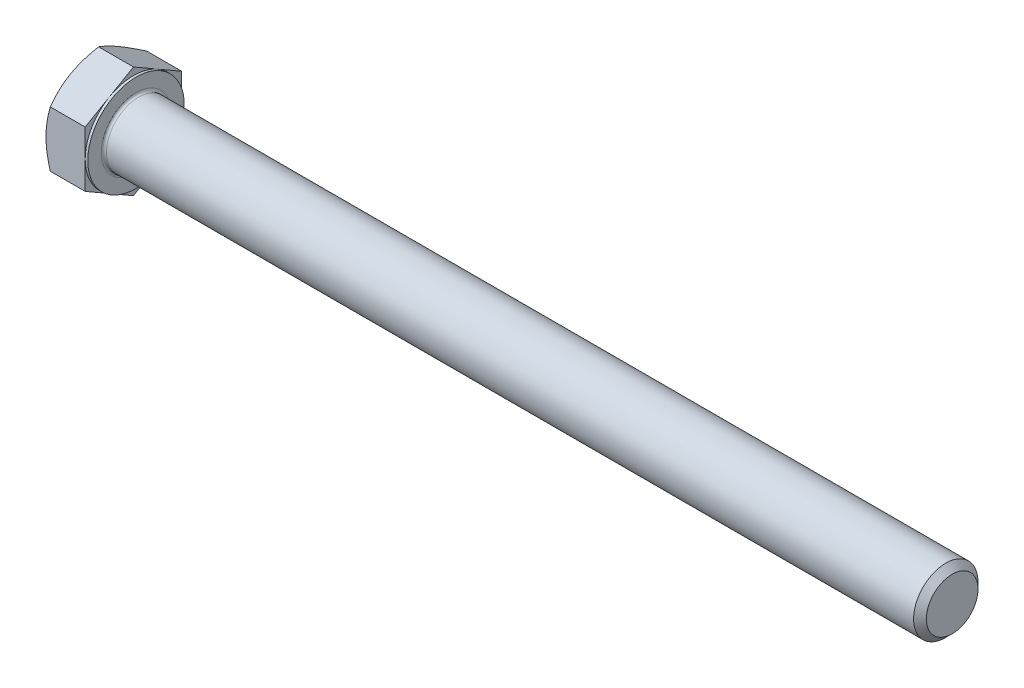
ISO-10303-21;
HEADER;
FILE_DESCRIPTION(('STEP AP214'),'2;1');
FILE_NAME('part.step','',(''),(''),'','','');
FILE_SCHEMA(('AUTOMOTIVE_DESIGN { 1 0 10303 214 1 1 1 1 }'));
ENDSEC;
DATA;
#1=APPLICATION_CONTEXT('core data for automotive mechanical design processes');
#2=APPLICATION_PROTOCOL_DEFINITION('international standard','automotive_design',2000,#1);
#3=PRODUCT_CONTEXT('',#1,'mechanical');
#4=PRODUCT('Part','Part','',(#3));
#5=PRODUCT_RELATED_PRODUCT_CATEGORY('part','',(#4));
#6=PRODUCT_DEFINITION_FORMATION('','',#4);
#7=PRODUCT_DEFINITION_CONTEXT('part definition',#1,'design');
#8=PRODUCT_DEFINITION('design','',#6,#7);
#9=PRODUCT_DEFINITION_SHAPE('','',#8);
#10=(LENGTH_UNIT() NAMED_UNIT(*) SI_UNIT(.MILLI.,.METRE.));
#11=(NAMED_UNIT(*) PLANE_ANGLE_UNIT() SI_UNIT($,.RADIAN.));
#12=(NAMED_UNIT(*) SI_UNIT($,.STERADIAN.) SOLID_ANGLE_UNIT());
#13=UNCERTAINTY_MEASURE_WITH_UNIT(LENGTH_MEASURE(1.E-05),#10,'distance_accuracy_value','');
#14=(GEOMETRIC_REPRESENTATION_CONTEXT(3) GLOBAL_UNCERTAINTY_ASSIGNED_CONTEXT((#13)) GLOBAL_UNIT_ASSIGNED_CONTEXT((#10,
#11,#12)) REPRESENTATION_CONTEXT('',''));
#15=CARTESIAN_POINT('',(0.,0.,0.));
#16=DIRECTION('',(0.,0.,1.));
#17=DIRECTION('',(1.,0.,0.));
#18=AXIS2_PLACEMENT_3D('',#15,#16,#17);
#19=CARTESIAN_POINT('',(0.,8.24155962262808,0.));
#20=DIRECTION('',(1.,0.,0.));
#21=DIRECTION('',(0.,0.,-1.));
#22=AXIS2_PLACEMENT_3D('',#19,#20,#21);
#23=PLANE('',#22);
#24=CARTESIAN_POINT('',(0.,0.,0.));
#25=DIRECTION('',(1.,0.,0.));
#26=DIRECTION('',(0.,0.,-1.));
#27=AXIS2_PLACEMENT_3D('',#24,#25,#26);
#28=CIRCLE('',#27,7.1374);
#29=CARTESIAN_POINT('',(0.,-6.18116971697105,-3.56870000000001));
#30=VERTEX_POINT('',#29);
#31=CARTESIAN_POINT('',(0.,0.,-7.1374));
#32=VERTEX_POINT('',#31);
#33=EDGE_CURVE('E114',#30,#32,#28,.T.);
#34=ORIENTED_EDGE('',*,*,#33,.F.);
#35=CARTESIAN_POINT('',(0.,0.,0.));
#36=DIRECTION('',(1.,0.,0.));
#37=DIRECTION('',(0.,0.,-1.));
#38=AXIS2_PLACEMENT_3D('',#35,#36,#37);
#39=CIRCLE('',#38,7.1374);
#40=CARTESIAN_POINT('',(0.,-6.18116971697106,3.56870000000001));
#41=VERTEX_POINT('',#40);
#42=EDGE_CURVE('E111',#41,#30,#39,.T.);
#43=ORIENTED_EDGE('',*,*,#42,.F.);
#44=CARTESIAN_POINT('',(0.,0.,0.));
#45=DIRECTION('',(1.,0.,0.));
#46=DIRECTION('',(0.,0.,-1.));
#47=AXIS2_PLACEMENT_3D('',#44,#45,#46);
#48=CIRCLE('',#47,7.1374);
#49=CARTESIAN_POINT('',(0.,0.,7.1374));
#50=VERTEX_POINT('',#49);
#51=EDGE_CURVE('E462',#50,#41,#48,.T.);
#52=ORIENTED_EDGE('',*,*,#51,.F.);
#53=CARTESIAN_POINT('',(0.,0.,0.));
#54=DIRECTION('',(1.,0.,0.));
#55=DIRECTION('',(0.,0.,-1.));
#56=AXIS2_PLACEMENT_3D('',#53,#54,#55);
#57=CIRCLE('',#56,7.1374);
#58=CARTESIAN_POINT('',(0.,6.18116971697105,3.56870000000001));
#59=VERTEX_POINT('',#58);
#60=EDGE_CURVE('E172',#59,#50,#57,.T.);
#61=ORIENTED_EDGE('',*,*,#60,.F.);
#62=CARTESIAN_POINT('',(0.,0.,0.));
#63=DIRECTION('',(1.,0.,0.));
#64=DIRECTION('',(0.,0.,-1.));
#65=AXIS2_PLACEMENT_3D('',#62,#63,#64);
#66=CIRCLE('',#65,7.1374);
#67=CARTESIAN_POINT('',(0.,6.18116971697105,-3.56870000000001));
#68=VERTEX_POINT('',#67);
#69=EDGE_CURVE('E460',#68,#59,#66,.T.);
#70=ORIENTED_EDGE('',*,*,#69,.F.);
#71=CARTESIAN_POINT('',(0.,0.,0.));
#72=DIRECTION('',(1.,0.,0.));
#73=DIRECTION('',(0.,0.,-1.));
#74=AXIS2_PLACEMENT_3D('',#71,#72,#73);
#75=CIRCLE('',#74,7.1374);
#76=EDGE_CURVE('E117',#32,#68,#75,.T.);
#77=ORIENTED_EDGE('',*,*,#76,.F.);
#78=EDGE_LOOP('',(#34,#43,#52,#61,#70,#77));
#79=FACE_BOUND('',#78,.T.);
#80=ADVANCED_FACE('F17',(#79),#23,.F.);
#81=CARTESIAN_POINT('',(0.641311776484754,0.,0.));
#82=DIRECTION('',(1.,0.,0.));
#83=DIRECTION('',(0.,0.,-1.));
#84=AXIS2_PLACEMENT_3D('',#81,#82,#83);
#85=CONICAL_SURFACE('',#84,8.24818458036387,1.0471975511966);
#86=ORIENTED_EDGE('',*,*,#42,.T.);
#87=CARTESIAN_POINT('',(0.,-6.18116971697106,-3.56870000000002));
#88=CARTESIAN_POINT('',(-2.91702878281906E-05,-6.26862170985652,-3.41722870509925));
#89=CARTESIAN_POINT('',(0.00371114889844038,-6.35606948988297,-3.26576470708432));
#90=CARTESIAN_POINT('',(0.0185139577467835,-6.53079334497843,-2.9631341127647));
#91=CARTESIAN_POINT('',(0.0295749978503088,-6.61806945060963,-2.81196746352471));
#92=CARTESIAN_POINT('',(0.0587296036169501,-6.7918862225359,-2.5109079833408));
#93=CARTESIAN_POINT('',(0.0767877659737066,-6.87842838481195,-2.3610125612818));
#94=CARTESIAN_POINT('',(0.119548178265526,-7.05110039256495,-2.06193587080869));
#95=CARTESIAN_POINT('',(0.144250603082628,-7.13723022712836,-1.91275462129736));
#96=CARTESIAN_POINT('',(0.227561148311189,-7.39464422393007,-1.46690050025742));
#97=CARTESIAN_POINT('',(0.295412992760169,-7.56518058886256,-1.17152285165624));
#98=CARTESIAN_POINT('',(0.451896700790797,-7.90478678087675,-0.583307672522674));
#99=CARTESIAN_POINT('',(0.540632343376944,-8.07384476218822,-0.290490659466179));
#100=CARTESIAN_POINT('',(0.637486855352638,-8.2415596226281,0.));
#101=B_SPLINE_CURVE_WITH_KNOTS('',3,(#87,#88,#89,#90,#91,#92,#93,#94,#95,#96,#97,#98,#99,#100),
.UNSPECIFIED.,.F.,.F.,(4,2,2,2,2,2,4),(0.,0.524658409500519,1.04921296370403,1.5711473776056,
2.09309553056225,3.13562382142666,4.18344647054619),.UNSPECIFIED.);
#102=CARTESIAN_POINT('',(0.637486855352637,-8.2415596226281,0.));
#103=VERTEX_POINT('',#102);
#104=EDGE_CURVE('E129',#30,#103,#101,.T.);
#105=ORIENTED_EDGE('',*,*,#104,.T.);
#106=CARTESIAN_POINT('',(0.637486855352637,-8.2415596226281,0.));
#107=CARTESIAN_POINT('',(0.540632343376944,-8.07384476218822,0.290490659466181));
#108=CARTESIAN_POINT('',(0.451896700790797,-7.90478678087675,0.583307672522676));
#109=CARTESIAN_POINT('',(0.295412992760169,-7.56518058886257,1.17152285165624));
#110=CARTESIAN_POINT('',(0.227561148311189,-7.39464422393008,1.46690050025742));
#111=CARTESIAN_POINT('',(0.14425060308263,-7.13723022712836,1.91275462129736));
#112=CARTESIAN_POINT('',(0.119548178265528,-7.05110039256495,2.06193587080869));
#113=CARTESIAN_POINT('',(0.0767877659737086,-6.87842838481196,2.3610125612818));
#114=CARTESIAN_POINT('',(0.0587296036169518,-6.7918862225359,2.5109079833408));
#115=CARTESIAN_POINT('',(0.0295749978503104,-6.61806945060963,2.81196746352471));
#116=CARTESIAN_POINT('',(0.0185139577467855,-6.53079334497843,2.9631341127647));
#117=CARTESIAN_POINT('',(0.00371114889844278,-6.35606948988298,3.26576470708432));
#118=CARTESIAN_POINT('',(-2.91702878256121E-05,-6.26862170985652,3.41722870509925));
#119=CARTESIAN_POINT('',(0.,-6.18116971697107,3.56870000000002));
#120=B_SPLINE_CURVE_WITH_KNOTS('',3,(#106,#107,#108,#109,#110,#111,#112,#113,#114,#115,#116,
#117,#118,#119),.UNSPECIFIED.,.F.,.F.,(4,2,2,2,2,2,4),(0.,1.04782264911953,2.09035093998394,
2.61229909294058,3.13423350684215,3.65878806104566,4.18344647054618),.UNSPECIFIED.);
#121=EDGE_CURVE('E135',#103,#41,#120,.T.);
#122=ORIENTED_EDGE('',*,*,#121,.T.);
#123=EDGE_LOOP('',(#86,#105,#122));
#124=FACE_BOUND('',#123,.T.);
#125=ADVANCED_FACE('F133',(#124),#85,.T.);
#126=CARTESIAN_POINT('',(0.641311776484743,0.,0.));
#127=DIRECTION('',(1.,0.,0.));
#128=DIRECTION('',(0.,0.,-1.));
#129=AXIS2_PLACEMENT_3D('',#126,#127,#128);
#130=CONICAL_SURFACE('',#129,8.24818458036385,1.0471975511966);
#131=ORIENTED_EDGE('',*,*,#33,.T.);
#132=CARTESIAN_POINT('',(0.,0.,-7.1374));
#133=CARTESIAN_POINT('',(-2.91702878363875E-05,-0.174903985770917,-7.1374));
#134=CARTESIAN_POINT('',(0.0037111488984321,-0.349799545823828,-7.1374));
#135=CARTESIAN_POINT('',(0.0185139577467752,-0.699247256014727,-7.1374));
#136=CARTESIAN_POINT('',(0.0295749978503004,-0.873799467277128,-7.1374));
#137=CARTESIAN_POINT('',(0.0587296036169417,-1.22143301112966,-7.1374));
#138=CARTESIAN_POINT('',(0.0767877659736981,-1.39451733568178,-7.1374));
#139=CARTESIAN_POINT('',(0.119548178265518,-1.73986135118776,-7.1374));
#140=CARTESIAN_POINT('',(0.144250603082619,-1.91212102031459,-7.1374));
#141=CARTESIAN_POINT('',(0.227561148311179,-2.42694901391801,-7.1374));
#142=CARTESIAN_POINT('',(0.295412992760159,-2.76802174378299,-7.1374));
#143=CARTESIAN_POINT('',(0.451896700790786,-3.44723412781136,-7.1374));
#144=CARTESIAN_POINT('',(0.540632343376933,-3.7853500904343,-7.1374));
#145=CARTESIAN_POINT('',(0.637486855352627,-4.12077981131404,-7.1374));
#146=B_SPLINE_CURVE_WITH_KNOTS('',3,(#132,#133,#134,#135,#136,#137,#138,#139,#140,#141,#142,
#143,#144,#145),.UNSPECIFIED.,.F.,.F.,(4,2,2,2,2,2,4),(0.,0.524658409500517,1.04921296370403,
1.5711473776056,2.09309553056224,3.13562382142665,4.18344647054617),.UNSPECIFIED.);
#147=CARTESIAN_POINT('',(0.637486855352626,-4.12077981131404,-7.1374));
#148=VERTEX_POINT('',#147);
#149=EDGE_CURVE('E125',#32,#148,#146,.T.);
#150=ORIENTED_EDGE('',*,*,#149,.T.);
#151=CARTESIAN_POINT('',(0.637486855352626,-4.12077981131404,-7.1374));
#152=CARTESIAN_POINT('',(0.540632343376933,-4.28849467175391,-6.84690934053382));
#153=CARTESIAN_POINT('',(0.451896700790788,-4.45755265306538,-6.55409232747733));
#154=CARTESIAN_POINT('',(0.295412992760162,-4.79715884507957,-5.96587714834377));
#155=CARTESIAN_POINT('',(0.227561148311183,-4.96769521001206,-5.6704994997426));
#156=CARTESIAN_POINT('',(0.144250603082625,-5.22510920681377,-5.22464537870266));
#157=CARTESIAN_POINT('',(0.119548178265524,-5.31123904137718,-5.07546412919133));
#158=CARTESIAN_POINT('',(0.076787765973705,-5.48391104913017,-4.77638743871822));
#159=CARTESIAN_POINT('',(0.0587296036169484,-5.57045321140623,-4.62649201665922));
#160=CARTESIAN_POINT('',(0.0295749978503076,-5.7442699833325,-4.32543253647532));
#161=CARTESIAN_POINT('',(0.0185139577467831,-5.8315460889637,-4.17426588723533));
#162=CARTESIAN_POINT('',(0.00371114889844091,-6.00626994405915,-3.87163529291571));
#163=CARTESIAN_POINT('',(-2.91702878274496E-05,-6.0937177240856,-3.72017129490078));
#164=CARTESIAN_POINT('',(0.,-6.18116971697106,-3.56870000000002));
#165=B_SPLINE_CURVE_WITH_KNOTS('',3,(#151,#152,#153,#154,#155,#156,#157,#158,#159,#160,#161,
#162,#163,#164),.UNSPECIFIED.,.F.,.F.,(4,2,2,2,2,2,4),(0.,1.04782264911952,2.09035093998392,
2.61229909294056,3.13423350684212,3.65878806104563,4.18344647054614),.UNSPECIFIED.);
#166=EDGE_CURVE('E123',#148,#30,#165,.T.);
#167=ORIENTED_EDGE('',*,*,#166,.T.);
#168=EDGE_LOOP('',(#131,#150,#167));
#169=FACE_BOUND('',#168,.T.);
#170=ADVANCED_FACE('F124',(#169),#130,.T.);
#171=CARTESIAN_POINT('',(0.641311776484739,0.,0.));
#172=DIRECTION('',(1.,0.,0.));
#173=DIRECTION('',(0.,0.,-1.));
#174=AXIS2_PLACEMENT_3D('',#171,#172,#173);
#175=CONICAL_SURFACE('',#174,8.24818458036384,1.0471975511966);
#176=CARTESIAN_POINT('',(0.637486855352624,4.12077981131404,-7.1374));
#177=CARTESIAN_POINT('',(0.540632343376931,3.78535009043429,-7.1374));
#178=CARTESIAN_POINT('',(0.451896700790785,3.44723412781136,-7.1374));
#179=CARTESIAN_POINT('',(0.295412992760157,2.76802174378299,-7.1374));
#180=CARTESIAN_POINT('',(0.227561148311177,2.42694901391801,-7.1374));
#181=CARTESIAN_POINT('',(0.144250603082619,1.91212102031458,-7.1374));
#182=CARTESIAN_POINT('',(0.119548178265517,1.73986135118776,-7.1374));
#183=CARTESIAN_POINT('',(0.076787765973698,1.39451733568178,-7.1374));
#184=CARTESIAN_POINT('',(0.0587296036169412,1.22143301112966,-7.1374));
#185=CARTESIAN_POINT('',(0.0295749978502998,0.873799467277126,-7.1374));
#186=CARTESIAN_POINT('',(0.018513957746775,0.699247256014726,-7.1374));
#187=CARTESIAN_POINT('',(0.0037111488984325,0.349799545823827,-7.1374));
#188=CARTESIAN_POINT('',(-2.91702878357943E-05,0.174903985770916,-7.1374));
#189=CARTESIAN_POINT('',(0.,0.,-7.1374));
#190=B_SPLINE_CURVE_WITH_KNOTS('',3,(#176,#177,#178,#179,#180,#181,#182,#183,#184,#185,#186,
#187,#188,#189),.UNSPECIFIED.,.F.,.F.,(4,2,2,2,2,2,4),(0.,1.04782264911952,2.09035093998393,
2.61229909294057,3.13423350684214,3.65878806104565,4.18344647054616),.UNSPECIFIED.);
#191=CARTESIAN_POINT('',(0.637486855352624,4.12077981131404,-7.1374));
#192=VERTEX_POINT('',#191);
#193=EDGE_CURVE('E143',#192,#32,#190,.T.);
#194=ORIENTED_EDGE('',*,*,#193,.T.);
#195=ORIENTED_EDGE('',*,*,#76,.T.);
#196=CARTESIAN_POINT('',(0.,6.18116971697105,-3.56870000000001));
#197=CARTESIAN_POINT('',(-2.9170287832926E-05,6.0937177240856,-3.72017129490077));
#198=CARTESIAN_POINT('',(0.00371114889843545,6.00626994405914,-3.8716352929157));
#199=CARTESIAN_POINT('',(0.018513957746778,5.83154608896369,-4.17426588723532));
#200=CARTESIAN_POINT('',(0.0295749978503029,5.74426998333249,-4.32543253647531));
#201=CARTESIAN_POINT('',(0.0587296036169437,5.57045321140622,-4.62649201665922));
#202=CARTESIAN_POINT('',(0.0767877659737001,5.48391104913017,-4.77638743871822));
#203=CARTESIAN_POINT('',(0.119548178265519,5.31123904137718,-5.07546412919132));
#204=CARTESIAN_POINT('',(0.144250603082621,5.22510920681376,-5.22464537870265));
#205=CARTESIAN_POINT('',(0.22756114831118,4.96769521001205,-5.67049949974259));
#206=CARTESIAN_POINT('',(0.295412992760159,4.79715884507956,-5.96587714834377));
#207=CARTESIAN_POINT('',(0.451896700790785,4.45755265306538,-6.55409232747733));
#208=CARTESIAN_POINT('',(0.540632343376931,4.28849467175391,-6.84690934053382));
#209=CARTESIAN_POINT('',(0.637486855352624,4.12077981131404,-7.1374));
#210=B_SPLINE_CURVE_WITH_KNOTS('',3,(#196,#197,#198,#199,#200,#201,#202,#203,#204,#205,#206,
#207,#208,#209),.UNSPECIFIED.,.F.,.F.,(4,2,2,2,2,2,4),(0.,0.524658409500515,1.04921296370402,
1.57114737760559,2.09309553056223,3.13562382142663,4.18344647054615),.UNSPECIFIED.);
#211=EDGE_CURVE('E249',#68,#192,#210,.T.);
#212=ORIENTED_EDGE('',*,*,#211,.T.);
#213=EDGE_LOOP('',(#194,#195,#212));
#214=FACE_BOUND('',#213,.T.);
#215=ADVANCED_FACE('F239',(#214),#175,.T.);
#216=CARTESIAN_POINT('',(0.641311776484745,0.,0.));
#217=DIRECTION('',(1.,0.,0.));
#218=DIRECTION('',(0.,0.,-1.));
#219=AXIS2_PLACEMENT_3D('',#216,#217,#218);
#220=CONICAL_SURFACE('',#219,8.24818458036385,1.0471975511966);
#221=CARTESIAN_POINT('',(0.637486855352629,8.24155962262808,0.));
#222=CARTESIAN_POINT('',(0.540632343376936,8.07384476218821,-0.290490659466181));
#223=CARTESIAN_POINT('',(0.45189670079079,7.90478678087674,-0.583307672522675));
#224=CARTESIAN_POINT('',(0.295412992760162,7.56518058886255,-1.17152285165624));
#225=CARTESIAN_POINT('',(0.227561148311182,7.39464422393006,-1.46690050025742));
#226=CARTESIAN_POINT('',(0.144250603082622,7.13723022712835,-1.91275462129736));
#227=CARTESIAN_POINT('',(0.119548178265521,7.05110039256494,-2.06193587080869));
#228=CARTESIAN_POINT('',(0.076787765973701,6.87842838481194,-2.3610125612818));
#229=CARTESIAN_POINT('',(0.0587296036169442,6.79188622253589,-2.5109079833408));
#230=CARTESIAN_POINT('',(0.0295749978503029,6.61806945060962,-2.81196746352471));
#231=CARTESIAN_POINT('',(0.018513957746778,6.53079334497842,-2.96313411276469));
#232=CARTESIAN_POINT('',(0.00371114889843529,6.35606948988297,-3.26576470708432));
#233=CARTESIAN_POINT('',(-2.91702878331806E-05,6.26862170985651,-3.41722870509924));
#234=CARTESIAN_POINT('',(0.,6.18116971697105,-3.56870000000001));
#235=B_SPLINE_CURVE_WITH_KNOTS('',3,(#221,#222,#223,#224,#225,#226,#227,#228,#229,#230,#231,
#232,#233,#234),.UNSPECIFIED.,.F.,.F.,(4,2,2,2,2,2,4),(0.,1.04782264911952,2.09035093998393,
2.61229909294058,3.13423350684215,3.65878806104566,4.18344647054617),.UNSPECIFIED.);
#236=CARTESIAN_POINT('',(0.637486855352629,8.24155962262808,0.));
#237=VERTEX_POINT('',#236);
#238=EDGE_CURVE('E244',#237,#68,#235,.T.);
#239=ORIENTED_EDGE('',*,*,#238,.T.);
#240=ORIENTED_EDGE('',*,*,#69,.T.);
#241=CARTESIAN_POINT('',(0.,6.18116971697105,3.56870000000001));
#242=CARTESIAN_POINT('',(-2.9170287834756E-05,6.26862170985651,3.41722870509925));
#243=CARTESIAN_POINT('',(0.00371114889843365,6.35606948988296,3.26576470708432));
#244=CARTESIAN_POINT('',(0.018513957746776,6.53079334497841,2.9631341127647));
#245=CARTESIAN_POINT('',(0.0295749978503007,6.61806945060961,2.81196746352471));
#246=CARTESIAN_POINT('',(0.0587296036169419,6.79188622253588,2.5109079833408));
#247=CARTESIAN_POINT('',(0.0767877659736988,6.87842838481194,2.3610125612818));
#248=CARTESIAN_POINT('',(0.119548178265519,7.05110039256493,2.06193587080869));
#249=CARTESIAN_POINT('',(0.14425060308262,7.13723022712835,1.91275462129736));
#250=CARTESIAN_POINT('',(0.22756114831118,7.39464422393006,1.46690050025742));
#251=CARTESIAN_POINT('',(0.295412992760161,7.56518058886255,1.17152285165624));
#252=CARTESIAN_POINT('',(0.451896700790789,7.90478678087674,0.583307672522675));
#253=CARTESIAN_POINT('',(0.540632343376935,8.07384476218821,0.29049065946618));
#254=CARTESIAN_POINT('',(0.637486855352629,8.24155962262808,0.));
#255=B_SPLINE_CURVE_WITH_KNOTS('',3,(#241,#242,#243,#244,#245,#246,#247,#248,#249,#250,#251,
#252,#253,#254),.UNSPECIFIED.,.F.,.F.,(4,2,2,2,2,2,4),(0.,0.524658409500518,1.04921296370403,
1.5711473776056,2.09309553056224,3.13562382142665,4.18344647054618),.UNSPECIFIED.);
#256=EDGE_CURVE('E231',#59,#237,#255,.T.);
#257=ORIENTED_EDGE('',*,*,#256,.T.);
#258=EDGE_LOOP('',(#239,#240,#257));
#259=FACE_BOUND('',#258,.T.);
#260=ADVANCED_FACE('F236',(#259),#220,.T.);
#261=CARTESIAN_POINT('',(0.641311776484745,0.,0.));
#262=DIRECTION('',(1.,0.,0.));
#263=DIRECTION('',(0.,0.,-1.));
#264=AXIS2_PLACEMENT_3D('',#261,#262,#263);
#265=CONICAL_SURFACE('',#264,8.24818458036385,1.0471975511966);
#266=ORIENTED_EDGE('',*,*,#51,.T.);
#267=CARTESIAN_POINT('',(0.,-6.18116971697107,3.56870000000002));
#268=CARTESIAN_POINT('',(-2.9170287825595E-05,-6.09371772408561,3.72017129490078));
#269=CARTESIAN_POINT('',(0.00371114889844298,-6.00626994405915,3.87163529291571));
#270=CARTESIAN_POINT('',(0.0185139577467859,-5.8315460889637,4.17426588723533));
#271=CARTESIAN_POINT('',(0.0295749978503109,-5.7442699833325,4.32543253647531));
#272=CARTESIAN_POINT('',(0.0587296036169516,-5.57045321140624,4.62649201665922));
#273=CARTESIAN_POINT('',(0.0767877659737078,-5.48391104913018,4.77638743871822));
#274=CARTESIAN_POINT('',(0.119548178265527,-5.31123904137719,5.07546412919133));
#275=CARTESIAN_POINT('',(0.144250603082628,-5.22510920681378,5.22464537870266));
#276=CARTESIAN_POINT('',(0.227561148311187,-4.96769521001206,5.6704994997426));
#277=CARTESIAN_POINT('',(0.295412992760166,-4.79715884507958,5.96587714834377));
#278=CARTESIAN_POINT('',(0.451896700790791,-4.45755265306539,6.55409232747733));
#279=CARTESIAN_POINT('',(0.540632343376936,-4.28849467175392,6.84690934053382));
#280=CARTESIAN_POINT('',(0.637486855352629,-4.12077981131405,7.1374));
#281=B_SPLINE_CURVE_WITH_KNOTS('',3,(#267,#268,#269,#270,#271,#272,#273,#274,#275,#276,#277,
#278,#279,#280),.UNSPECIFIED.,.F.,.F.,(4,2,2,2,2,2,4),(0.,0.524658409500513,1.04921296370402,
1.57114737760559,2.09309553056223,3.13562382142663,4.18344647054615),.UNSPECIFIED.);
#282=CARTESIAN_POINT('',(0.637486855352629,-4.12077981131405,7.1374));
#283=VERTEX_POINT('',#282);
#284=EDGE_CURVE('E130',#41,#283,#281,.T.);
#285=ORIENTED_EDGE('',*,*,#284,.T.);
#286=CARTESIAN_POINT('',(0.637486855352629,-4.12077981131405,7.1374));
#287=CARTESIAN_POINT('',(0.540632343376935,-3.78535009043431,7.1374));
#288=CARTESIAN_POINT('',(0.451896700790788,-3.44723412781137,7.1374));
#289=CARTESIAN_POINT('',(0.29541299276016,-2.768021743783,7.1374));
#290=CARTESIAN_POINT('',(0.22756114831118,-2.42694901391802,7.1374));
#291=CARTESIAN_POINT('',(0.14425060308262,-1.91212102031459,7.1374));
#292=CARTESIAN_POINT('',(0.119548178265519,-1.73986135118776,7.1374));
#293=CARTESIAN_POINT('',(0.0767877659736989,-1.39451733568178,7.1374));
#294=CARTESIAN_POINT('',(0.0587296036169421,-1.22143301112967,7.1374));
#295=CARTESIAN_POINT('',(0.0295749978503008,-0.87379946727713,7.1374));
#296=CARTESIAN_POINT('',(0.018513957746776,-0.699247256014728,7.1374));
#297=CARTESIAN_POINT('',(0.00371114889843334,-0.349799545823828,7.1374));
#298=CARTESIAN_POINT('',(-2.91702878350887E-05,-0.174903985770916,7.1374));
#299=CARTESIAN_POINT('',(0.,0.,7.1374));
#300=B_SPLINE_CURVE_WITH_KNOTS('',3,(#286,#287,#288,#289,#290,#291,#292,#293,#294,#295,#296,
#297,#298,#299),.UNSPECIFIED.,.F.,.F.,(4,2,2,2,2,2,4),(0.,1.04782264911953,2.09035093998394,
2.61229909294058,3.13423350684215,3.65878806104566,4.18344647054618),.UNSPECIFIED.);
#301=EDGE_CURVE('E209',#283,#50,#300,.T.);
#302=ORIENTED_EDGE('',*,*,#301,.T.);
#303=EDGE_LOOP('',(#266,#285,#302));
#304=FACE_BOUND('',#303,.T.);
#305=ADVANCED_FACE('F187',(#304),#265,.T.);
#306=CARTESIAN_POINT('',(0.641311776484738,0.,0.));
#307=DIRECTION('',(1.,0.,0.));
#308=DIRECTION('',(0.,0.,-1.));
#309=AXIS2_PLACEMENT_3D('',#306,#307,#308);
#310=CONICAL_SURFACE('',#309,8.24818458036384,1.0471975511966);
#311=CARTESIAN_POINT('',(0.637486855352622,4.12077981131403,7.1374));
#312=CARTESIAN_POINT('',(0.540632343376929,4.2884946717539,6.84690934053382));
#313=CARTESIAN_POINT('',(0.451896700790783,4.45755265306537,6.55409232747733));
#314=CARTESIAN_POINT('',(0.295412992760157,4.79715884507955,5.96587714834377));
#315=CARTESIAN_POINT('',(0.227561148311178,4.96769521001204,5.67049949974259));
#316=CARTESIAN_POINT('',(0.144250603082619,5.22510920681376,5.22464537870266));
#317=CARTESIAN_POINT('',(0.119548178265518,5.31123904137717,5.07546412919132));
#318=CARTESIAN_POINT('',(0.0767877659736985,5.48391104913016,4.77638743871822));
#319=CARTESIAN_POINT('',(0.0587296036169418,5.57045321140622,4.62649201665922));
#320=CARTESIAN_POINT('',(0.0295749978503007,5.74426998333248,4.32543253647531));
#321=CARTESIAN_POINT('',(0.0185139577467759,5.83154608896368,4.17426588723532));
#322=CARTESIAN_POINT('',(0.00371114889843337,6.00626994405913,3.8716352929157));
#323=CARTESIAN_POINT('',(-2.91702878350612E-05,6.09371772408559,3.72017129490078));
#324=CARTESIAN_POINT('',(0.,6.18116971697105,3.56870000000001));
#325=B_SPLINE_CURVE_WITH_KNOTS('',3,(#311,#312,#313,#314,#315,#316,#317,#318,#319,#320,#321,
#322,#323,#324),.UNSPECIFIED.,.F.,.F.,(4,2,2,2,2,2,4),(0.,1.04782264911952,2.09035093998392,
2.61229909294056,3.13423350684213,3.65878806104564,4.18344647054615),.UNSPECIFIED.);
#326=CARTESIAN_POINT('',(0.637486855352622,4.12077981131403,7.1374));
#327=VERTEX_POINT('',#326);
#328=EDGE_CURVE('E193',#327,#59,#325,.T.);
#329=ORIENTED_EDGE('',*,*,#328,.T.);
#330=ORIENTED_EDGE('',*,*,#60,.T.);
#331=CARTESIAN_POINT('',(0.,0.,7.1374));
#332=CARTESIAN_POINT('',(-2.91702878350349E-05,0.174903985770917,7.1374));
#333=CARTESIAN_POINT('',(0.00371114889843339,0.349799545823827,7.1374));
#334=CARTESIAN_POINT('',(0.0185139577467758,0.699247256014725,7.1374));
#335=CARTESIAN_POINT('',(0.0295749978503005,0.873799467277125,7.1374));
#336=CARTESIAN_POINT('',(0.0587296036169414,1.22143301112966,7.1374));
#337=CARTESIAN_POINT('',(0.076787765973698,1.39451733568177,7.1374));
#338=CARTESIAN_POINT('',(0.119548178265517,1.73986135118775,7.1374));
#339=CARTESIAN_POINT('',(0.144250603082619,1.91212102031458,7.1374));
#340=CARTESIAN_POINT('',(0.227561148311177,2.426949013918,7.1374));
#341=CARTESIAN_POINT('',(0.295412992760157,2.76802174378298,7.1374));
#342=CARTESIAN_POINT('',(0.451896700790783,3.44723412781135,7.1374));
#343=CARTESIAN_POINT('',(0.540632343376929,3.78535009043429,7.1374));
#344=CARTESIAN_POINT('',(0.637486855352622,4.12077981131403,7.1374));
#345=B_SPLINE_CURVE_WITH_KNOTS('',3,(#331,#332,#333,#334,#335,#336,#337,#338,#339,#340,#341,
#342,#343,#344),.UNSPECIFIED.,.F.,.F.,(4,2,2,2,2,2,4),(0.,0.524658409500515,1.04921296370402,
1.57114737760559,2.09309553056223,3.13562382142663,4.18344647054615),.UNSPECIFIED.);
#346=EDGE_CURVE('E201',#50,#327,#345,.T.);
#347=ORIENTED_EDGE('',*,*,#346,.T.);
#348=EDGE_LOOP('',(#329,#330,#347));
#349=FACE_BOUND('',#348,.T.);
#350=ADVANCED_FACE('F182',(#349),#310,.T.);
#351=CARTESIAN_POINT('',(6.1722,-8.2415596226281,0.));
#352=DIRECTION('',(0.,0.866025403784438,-0.500000000000001));
#353=DIRECTION('',(0.,0.500000000000001,0.866025403784438));
#354=AXIS2_PLACEMENT_3D('',#351,#352,#353);
#355=PLANE('',#354);
#356=DIRECTION('',(-1.,0.,0.));
#357=VECTOR('',#356,1.);
#358=CARTESIAN_POINT('',(6.1722,-4.12077981131405,7.1374));
#359=LINE('',#358,#357);
#360=CARTESIAN_POINT('',(5.7912,-4.12077981131405,7.1374));
#361=VERTEX_POINT('',#360);
#362=EDGE_CURVE('E386',#361,#283,#359,.T.);
#363=ORIENTED_EDGE('',*,*,#362,.T.);
#364=ORIENTED_EDGE('',*,*,#284,.F.);
#365=ORIENTED_EDGE('',*,*,#121,.F.);
#366=DIRECTION('',(1.,0.,0.));
#367=VECTOR('',#366,1.);
#368=CARTESIAN_POINT('',(6.1722,-8.2415596226281,0.));
#369=LINE('',#368,#367);
#370=CARTESIAN_POINT('',(5.7912,-8.2415596226281,0.));
#371=VERTEX_POINT('',#370);
#372=EDGE_CURVE('E141',#103,#371,#369,.T.);
#373=ORIENTED_EDGE('',*,*,#372,.T.);
#374=DIRECTION('',(0.,-0.500000000000005,-0.866025403784436));
#375=VECTOR('',#374,1.);
#376=CARTESIAN_POINT('',(5.7912,-6.18116971697105,3.5687));
#377=LINE('',#376,#375);
#378=CARTESIAN_POINT('',(5.7912,-6.18116971697105,3.5687));
#379=VERTEX_POINT('',#378);
#380=EDGE_CURVE('E366',#379,#371,#377,.T.);
#381=ORIENTED_EDGE('',*,*,#380,.F.);
#382=DIRECTION('',(0.,-0.499999999999996,-0.866025403784441));
#383=VECTOR('',#382,1.);
#384=CARTESIAN_POINT('',(5.7912,-4.12077981131405,7.1374));
#385=LINE('',#384,#383);
#386=EDGE_CURVE('E371',#361,#379,#385,.T.);
#387=ORIENTED_EDGE('',*,*,#386,.F.);
#388=EDGE_LOOP('',(#363,#364,#365,#373,#381,#387));
#389=FACE_BOUND('',#388,.T.);
#390=ADVANCED_FACE('F178',(#389),#355,.F.);
#391=CARTESIAN_POINT('',(6.1722,-4.12077981131404,-7.1374));
#392=DIRECTION('',(0.,0.866025403784438,0.500000000000001));
#393=DIRECTION('',(0.,-0.500000000000001,0.866025403784438));
#394=AXIS2_PLACEMENT_3D('',#391,#392,#393);
#395=PLANE('',#394);
#396=ORIENTED_EDGE('',*,*,#372,.F.);
#397=ORIENTED_EDGE('',*,*,#104,.F.);
#398=ORIENTED_EDGE('',*,*,#166,.F.);
#399=DIRECTION('',(1.,0.,0.));
#400=VECTOR('',#399,1.);
#401=CARTESIAN_POINT('',(6.1722,-4.12077981131404,-7.1374));
#402=LINE('',#401,#400);
#403=CARTESIAN_POINT('',(5.7912,-4.12077981131404,-7.1374));
#404=VERTEX_POINT('',#403);
#405=EDGE_CURVE('E250',#148,#404,#402,.T.);
#406=ORIENTED_EDGE('',*,*,#405,.T.);
#407=DIRECTION('',(0.,0.499999999999998,-0.866025403784439));
#408=VECTOR('',#407,1.);
#409=CARTESIAN_POINT('',(5.7912,-6.18116971697105,-3.56870000000001));
#410=LINE('',#409,#408);
#411=CARTESIAN_POINT('',(5.7912,-6.18116971697104,-3.56870000000001));
#412=VERTEX_POINT('',#411);
#413=EDGE_CURVE('E356',#412,#404,#410,.T.);
#414=ORIENTED_EDGE('',*,*,#413,.F.);
#415=DIRECTION('',(0.,0.500000000000005,-0.866025403784436));
#416=VECTOR('',#415,1.);
#417=CARTESIAN_POINT('',(5.7912,-8.2415596226281,0.));
#418=LINE('',#417,#416);
#419=EDGE_CURVE('E361',#371,#412,#418,.T.);
#420=ORIENTED_EDGE('',*,*,#419,.F.);
#421=EDGE_LOOP('',(#396,#397,#398,#406,#414,#420));
#422=FACE_BOUND('',#421,.T.);
#423=ADVANCED_FACE('F139',(#422),#395,.F.);
#424=CARTESIAN_POINT('',(6.1722,4.12077981131404,-7.1374));
#425=DIRECTION('',(0.,0.,1.));
#426=DIRECTION('',(0.,-1.,0.));
#427=AXIS2_PLACEMENT_3D('',#424,#425,#426);
#428=PLANE('',#427);
#429=ORIENTED_EDGE('',*,*,#405,.F.);
#430=ORIENTED_EDGE('',*,*,#149,.F.);
#431=ORIENTED_EDGE('',*,*,#193,.F.);
#432=DIRECTION('',(1.,0.,0.));
#433=VECTOR('',#432,1.);
#434=CARTESIAN_POINT('',(6.1722,4.12077981131404,-7.1374));
#435=LINE('',#434,#433);
#436=CARTESIAN_POINT('',(5.7912,4.12077981131404,-7.1374));
#437=VERTEX_POINT('',#436);
#438=EDGE_CURVE('E394',#192,#437,#435,.T.);
#439=ORIENTED_EDGE('',*,*,#438,.T.);
#440=DIRECTION('',(0.,1.,0.));
#441=VECTOR('',#440,1.);
#442=CARTESIAN_POINT('',(5.7912,7.1374,-7.1374));
#443=LINE('',#442,#441);
#444=CARTESIAN_POINT('',(5.7912,0.,-7.1374));
#445=VERTEX_POINT('',#444);
#446=EDGE_CURVE('E341',#445,#437,#443,.T.);
#447=ORIENTED_EDGE('',*,*,#446,.F.);
#448=DIRECTION('',(0.,1.,0.));
#449=VECTOR('',#448,1.);
#450=CARTESIAN_POINT('',(5.7912,7.1374,-7.1374));
#451=LINE('',#450,#449);
#452=EDGE_CURVE('E351',#404,#445,#451,.T.);
#453=ORIENTED_EDGE('',*,*,#452,.F.);
#454=EDGE_LOOP('',(#429,#430,#431,#439,#447,#453));
#455=FACE_BOUND('',#454,.T.);
#456=ADVANCED_FACE('F257',(#455),#428,.F.);
#457=CARTESIAN_POINT('',(6.1722,4.12077981131404,-7.1374));
#458=DIRECTION('',(0.,-0.866025403784438,0.500000000000001));
#459=DIRECTION('',(0.,-0.500000000000001,-0.866025403784438));
#460=AXIS2_PLACEMENT_3D('',#457,#458,#459);
#461=PLANE('',#460);
#462=ORIENTED_EDGE('',*,*,#438,.F.);
#463=ORIENTED_EDGE('',*,*,#211,.F.);
#464=ORIENTED_EDGE('',*,*,#238,.F.);
#465=DIRECTION('',(1.,0.,0.));
#466=VECTOR('',#465,1.);
#467=CARTESIAN_POINT('',(6.1722,8.24155962262808,0.));
#468=LINE('',#467,#466);
#469=CARTESIAN_POINT('',(5.7912,8.24155962262808,0.));
#470=VERTEX_POINT('',#469);
#471=EDGE_CURVE('E235',#237,#470,#468,.T.);
#472=ORIENTED_EDGE('',*,*,#471,.T.);
#473=DIRECTION('',(0.,0.500000000000002,0.866025403784437));
#474=VECTOR('',#473,1.);
#475=CARTESIAN_POINT('',(5.7912,6.18116971697105,-3.56870000000001));
#476=LINE('',#475,#474);
#477=CARTESIAN_POINT('',(5.7912,6.18116971697105,-3.5687));
#478=VERTEX_POINT('',#477);
#479=EDGE_CURVE('E336',#478,#470,#476,.T.);
#480=ORIENTED_EDGE('',*,*,#479,.F.);
#481=DIRECTION('',(0.,0.5,0.866025403784439));
#482=VECTOR('',#481,1.);
#483=CARTESIAN_POINT('',(5.7912,4.12077981131404,-7.1374));
#484=LINE('',#483,#482);
#485=EDGE_CURVE('E346',#437,#478,#484,.T.);
#486=ORIENTED_EDGE('',*,*,#485,.F.);
#487=EDGE_LOOP('',(#462,#463,#464,#472,#480,#486));
#488=FACE_BOUND('',#487,.T.);
#489=ADVANCED_FACE('F227',(#488),#461,.F.);
#490=CARTESIAN_POINT('',(6.1722,8.24155962262808,0.));
#491=DIRECTION('',(0.,-0.866025403784438,-0.500000000000001));
#492=DIRECTION('',(0.,0.500000000000001,-0.866025403784438));
#493=AXIS2_PLACEMENT_3D('',#490,#491,#492);
#494=PLANE('',#493);
#495=ORIENTED_EDGE('',*,*,#471,.F.);
#496=ORIENTED_EDGE('',*,*,#256,.F.);
#497=ORIENTED_EDGE('',*,*,#328,.F.);
#498=DIRECTION('',(-1.,0.,0.));
#499=VECTOR('',#498,1.);
#500=CARTESIAN_POINT('',(6.1722,4.12077981131403,7.1374));
#501=LINE('',#500,#499);
#502=CARTESIAN_POINT('',(5.7912,4.12077981131403,7.1374));
#503=VERTEX_POINT('',#502);
#504=EDGE_CURVE('E208',#327,#503,#501,.F.);
#505=ORIENTED_EDGE('',*,*,#504,.T.);
#506=DIRECTION('',(0.,-0.500000000000001,0.866025403784438));
#507=VECTOR('',#506,1.);
#508=CARTESIAN_POINT('',(5.7912,6.18116971697105,3.56870000000001));
#509=LINE('',#508,#507);
#510=CARTESIAN_POINT('',(5.7912,6.18116971697104,3.56870000000001));
#511=VERTEX_POINT('',#510);
#512=EDGE_CURVE('E326',#511,#503,#509,.T.);
#513=ORIENTED_EDGE('',*,*,#512,.F.);
#514=DIRECTION('',(0.,-0.500000000000002,0.866025403784438));
#515=VECTOR('',#514,1.);
#516=CARTESIAN_POINT('',(5.7912,8.24155962262808,0.));
#517=LINE('',#516,#515);
#518=EDGE_CURVE('E331',#470,#511,#517,.T.);
#519=ORIENTED_EDGE('',*,*,#518,.F.);
#520=EDGE_LOOP('',(#495,#496,#497,#505,#513,#519));
#521=FACE_BOUND('',#520,.T.);
#522=ADVANCED_FACE('F220',(#521),#494,.F.);
#523=CARTESIAN_POINT('',(6.1722,4.12077981131403,7.1374));
#524=DIRECTION('',(0.,0.,-1.));
#525=DIRECTION('',(-1.,0.,0.));
#526=AXIS2_PLACEMENT_3D('',#523,#524,#525);
#527=PLANE('',#526);
#528=ORIENTED_EDGE('',*,*,#504,.F.);
#529=ORIENTED_EDGE('',*,*,#346,.F.);
#530=ORIENTED_EDGE('',*,*,#301,.F.);
#531=ORIENTED_EDGE('',*,*,#362,.F.);
#532=DIRECTION('',(0.,1.,0.));
#533=VECTOR('',#532,1.);
#534=CARTESIAN_POINT('',(5.7912,7.1374,7.1374));
#535=LINE('',#534,#533);
#536=CARTESIAN_POINT('',(5.7912,0.,7.1374));
#537=VERTEX_POINT('',#536);
#538=EDGE_CURVE('E376',#537,#361,#535,.F.);
#539=ORIENTED_EDGE('',*,*,#538,.F.);
#540=DIRECTION('',(0.,1.,0.));
#541=VECTOR('',#540,1.);
#542=CARTESIAN_POINT('',(5.7912,7.1374,7.1374));
#543=LINE('',#542,#541);
#544=EDGE_CURVE('E318',#503,#537,#543,.F.);
#545=ORIENTED_EDGE('',*,*,#544,.F.);
#546=EDGE_LOOP('',(#528,#529,#530,#531,#539,#545));
#547=FACE_BOUND('',#546,.T.);
#548=ADVANCED_FACE('F215',(#547),#527,.F.);
#549=CARTESIAN_POINT('',(5.7912,7.1374,0.));
#550=DIRECTION('',(1.,0.,0.));
#551=DIRECTION('',(0.,0.,-1.));
#552=AXIS2_PLACEMENT_3D('',#549,#550,#551);
#553=PLANE('',#552);
#554=ORIENTED_EDGE('',*,*,#386,.T.);
#555=CARTESIAN_POINT('',(5.7912,0.,0.));
#556=DIRECTION('',(-1.,0.,0.));
#557=DIRECTION('',(0.,0.,1.));
#558=AXIS2_PLACEMENT_3D('',#555,#556,#557);
#559=CIRCLE('',#558,7.1374);
#560=EDGE_CURVE('E210',#537,#379,#559,.F.);
#561=ORIENTED_EDGE('',*,*,#560,.F.);
#562=ORIENTED_EDGE('',*,*,#538,.T.);
#563=EDGE_LOOP('',(#554,#561,#562));
#564=FACE_BOUND('',#563,.T.);
#565=ADVANCED_FACE('F219',(#564),#553,.T.);
#566=CARTESIAN_POINT('',(5.7912,7.1374,0.));
#567=DIRECTION('',(1.,0.,0.));
#568=DIRECTION('',(0.,0.,-1.));
#569=AXIS2_PLACEMENT_3D('',#566,#567,#568);
#570=PLANE('',#569);
#571=ORIENTED_EDGE('',*,*,#419,.T.);
#572=CARTESIAN_POINT('',(5.7912,0.,0.));
#573=DIRECTION('',(-1.,0.,0.));
#574=DIRECTION('',(0.,0.,1.));
#575=AXIS2_PLACEMENT_3D('',#572,#573,#574);
#576=CIRCLE('',#575,7.1374);
#577=EDGE_CURVE('E420',#379,#412,#576,.F.);
#578=ORIENTED_EDGE('',*,*,#577,.F.);
#579=ORIENTED_EDGE('',*,*,#380,.T.);
#580=EDGE_LOOP('',(#571,#578,#579));
#581=FACE_BOUND('',#580,.T.);
#582=ADVANCED_FACE('F440',(#581),#570,.T.);
#583=CARTESIAN_POINT('',(5.7912,7.1374,0.));
#584=DIRECTION('',(1.,0.,0.));
#585=DIRECTION('',(0.,0.,-1.));
#586=AXIS2_PLACEMENT_3D('',#583,#584,#585);
#587=PLANE('',#586);
#588=ORIENTED_EDGE('',*,*,#452,.T.);
#589=CARTESIAN_POINT('',(5.7912,0.,0.));
#590=DIRECTION('',(-1.,0.,0.));
#591=DIRECTION('',(0.,0.,1.));
#592=AXIS2_PLACEMENT_3D('',#589,#590,#591);
#593=CIRCLE('',#592,7.1374);
#594=EDGE_CURVE('E418',#412,#445,#593,.F.);
#595=ORIENTED_EDGE('',*,*,#594,.F.);
#596=ORIENTED_EDGE('',*,*,#413,.T.);
#597=EDGE_LOOP('',(#588,#595,#596));
#598=FACE_BOUND('',#597,.T.);
#599=ADVANCED_FACE('F443',(#598),#587,.T.);
#600=CARTESIAN_POINT('',(5.7912,7.1374,0.));
#601=DIRECTION('',(1.,0.,0.));
#602=DIRECTION('',(0.,0.,-1.));
#603=AXIS2_PLACEMENT_3D('',#600,#601,#602);
#604=PLANE('',#603);
#605=CARTESIAN_POINT('',(5.7912,0.,0.));
#606=DIRECTION('',(-1.,0.,0.));
#607=DIRECTION('',(0.,0.,1.));
#608=AXIS2_PLACEMENT_3D('',#605,#606,#607);
#609=CIRCLE('',#608,7.1374);
#610=EDGE_CURVE('E415',#445,#478,#609,.F.);
#611=ORIENTED_EDGE('',*,*,#610,.F.);
#612=ORIENTED_EDGE('',*,*,#446,.T.);
#613=ORIENTED_EDGE('',*,*,#485,.T.);
#614=EDGE_LOOP('',(#611,#612,#613));
#615=FACE_BOUND('',#614,.T.);
#616=ADVANCED_FACE('F447',(#615),#604,.T.);
#617=CARTESIAN_POINT('',(5.7912,7.1374,0.));
#618=DIRECTION('',(1.,0.,0.));
#619=DIRECTION('',(0.,0.,-1.));
#620=AXIS2_PLACEMENT_3D('',#617,#618,#619);
#621=PLANE('',#620);
#622=ORIENTED_EDGE('',*,*,#518,.T.);
#623=CARTESIAN_POINT('',(5.7912,0.,0.));
#624=DIRECTION('',(-1.,0.,0.));
#625=DIRECTION('',(0.,0.,1.));
#626=AXIS2_PLACEMENT_3D('',#623,#624,#625);
#627=CIRCLE('',#626,7.1374);
#628=EDGE_CURVE('E412',#478,#511,#627,.F.);
#629=ORIENTED_EDGE('',*,*,#628,.F.);
#630=ORIENTED_EDGE('',*,*,#479,.T.);
#631=EDGE_LOOP('',(#622,#629,#630));
#632=FACE_BOUND('',#631,.T.);
#633=ADVANCED_FACE('F452',(#632),#621,.T.);
#634=CARTESIAN_POINT('',(5.7912,7.1374,0.));
#635=DIRECTION('',(1.,0.,0.));
#636=DIRECTION('',(0.,0.,-1.));
#637=AXIS2_PLACEMENT_3D('',#634,#635,#636);
#638=PLANE('',#637);
#639=ORIENTED_EDGE('',*,*,#544,.T.);
#640=CARTESIAN_POINT('',(5.7912,0.,0.));
#641=DIRECTION('',(-1.,0.,0.));
#642=DIRECTION('',(0.,0.,1.));
#643=AXIS2_PLACEMENT_3D('',#640,#641,#642);
#644=CIRCLE('',#643,7.1374);
#645=EDGE_CURVE('E409',#511,#537,#644,.F.);
#646=ORIENTED_EDGE('',*,*,#645,.F.);
#647=ORIENTED_EDGE('',*,*,#512,.T.);
#648=EDGE_LOOP('',(#639,#646,#647));
#649=FACE_BOUND('',#648,.T.);
#650=ADVANCED_FACE('F433',(#649),#638,.T.);
#651=CARTESIAN_POINT('',(0.,0.,0.));
#652=DIRECTION('',(-1.,0.,0.));
#653=DIRECTION('',(0.,0.,1.));
#654=AXIS2_PLACEMENT_3D('',#651,#652,#653);
#655=CYLINDRICAL_SURFACE('',#654,7.1374);
#656=ORIENTED_EDGE('',*,*,#594,.T.);
#657=ORIENTED_EDGE('',*,*,#610,.T.);
#658=ORIENTED_EDGE('',*,*,#628,.T.);
#659=ORIENTED_EDGE('',*,*,#645,.T.);
#660=ORIENTED_EDGE('',*,*,#560,.T.);
#661=ORIENTED_EDGE('',*,*,#577,.T.);
#662=EDGE_LOOP('',(#656,#657,#658,#659,#660,#661));
#663=FACE_BOUND('',#662,.T.);
#664=CARTESIAN_POINT('',(6.1722,0.,0.));
#665=DIRECTION('',(-1.,0.,0.));
#666=DIRECTION('',(0.,0.,1.));
#667=AXIS2_PLACEMENT_3D('',#664,#665,#666);
#668=CIRCLE('',#667,7.1374);
#669=CARTESIAN_POINT('',(6.1722,0.,7.1374));
#670=VERTEX_POINT('',#669);
#671=EDGE_CURVE('E406',#670,#670,#668,.F.);
#672=ORIENTED_EDGE('',*,*,#671,.F.);
#673=EDGE_LOOP('',(#672));
#674=FACE_BOUND('',#673,.T.);
#675=ADVANCED_FACE('F426',(#663,#674),#655,.T.);
#676=CARTESIAN_POINT('',(126.8222,0.,0.));
#677=DIRECTION('',(-1.,0.,0.));
#678=DIRECTION('',(0.,0.,1.));
#679=AXIS2_PLACEMENT_3D('',#676,#677,#678);
#680=PLANE('',#679);
#681=CARTESIAN_POINT('',(126.822200000049,0.,0.));
#682=DIRECTION('',(-1.,0.,0.));
#683=DIRECTION('',(0.,0.,1.));
#684=AXIS2_PLACEMENT_3D('',#681,#682,#683);
#685=CIRCLE('',#684,3.8163499999655);
#686=CARTESIAN_POINT('',(126.822200000049,0.,3.8163499999655));
#687=VERTEX_POINT('',#686);
#688=EDGE_CURVE('E403',#687,#687,#685,.T.);
#689=ORIENTED_EDGE('',*,*,#688,.F.);
#690=EDGE_LOOP('',(#689));
#691=FACE_BOUND('',#690,.T.);
#692=ADVANCED_FACE('F302',(#691),#680,.F.);
#693=CARTESIAN_POINT('',(6.1722,8.24155962262808,0.));
#694=DIRECTION('',(1.,0.,0.));
#695=DIRECTION('',(0.,0.,-1.));
#696=AXIS2_PLACEMENT_3D('',#693,#694,#695);
#697=PLANE('',#696);
#698=ORIENTED_EDGE('',*,*,#671,.T.);
#699=EDGE_LOOP('',(#698));
#700=FACE_BOUND('',#699,.T.);
#701=CARTESIAN_POINT('',(6.1722,0.,0.));
#702=DIRECTION('',(1.,0.,0.));
#703=DIRECTION('',(0.,0.,1.));
#704=AXIS2_PLACEMENT_3D('',#701,#702,#703);
#705=CIRCLE('',#704,5.1435);
#706=CARTESIAN_POINT('',(6.1722,0.,-5.1435));
#707=VERTEX_POINT('',#706);
#708=CARTESIAN_POINT('',(6.1722,0.,5.1435));
#709=VERTEX_POINT('',#708);
#710=EDGE_CURVE('E289',#707,#709,#705,.F.);
#711=ORIENTED_EDGE('',*,*,#710,.T.);
#712=CARTESIAN_POINT('',(6.1722,0.,0.));
#713=DIRECTION('',(1.,0.,0.));
#714=DIRECTION('',(0.,0.,-1.));
#715=AXIS2_PLACEMENT_3D('',#712,#713,#714);
#716=CIRCLE('',#715,5.1435);
#717=EDGE_CURVE('E36',#709,#707,#716,.F.);
#718=ORIENTED_EDGE('',*,*,#717,.T.);
#719=EDGE_LOOP('',(#711,#718));
#720=FACE_BOUND('',#719,.T.);
#721=ADVANCED_FACE('F293',(#700,#720),#697,.T.);
#722=CARTESIAN_POINT('',(125.876050000102,0.,0.));
#723=DIRECTION('',(-1.,0.,0.));
#724=DIRECTION('',(0.,0.,1.));
#725=AXIS2_PLACEMENT_3D('',#722,#723,#724);
#726=CONICAL_SURFACE('',#725,4.7624999999698,0.785398163427488);
#727=CARTESIAN_POINT('',(125.87605,0.,0.));
#728=DIRECTION('',(-1.,0.,0.));
#729=DIRECTION('',(0.,0.,1.));
#730=AXIS2_PLACEMENT_3D('',#727,#728,#729);
#731=CIRCLE('',#730,4.7625);
#732=CARTESIAN_POINT('',(125.87605,0.,4.7625));
#733=VERTEX_POINT('',#732);
#734=EDGE_CURVE('E28',#733,#733,#731,.T.);
#735=ORIENTED_EDGE('',*,*,#734,.F.);
#736=EDGE_LOOP('',(#735));
#737=FACE_BOUND('',#736,.T.);
#738=ORIENTED_EDGE('',*,*,#688,.T.);
#739=EDGE_LOOP('',(#738));
#740=FACE_BOUND('',#739,.T.);
#741=ADVANCED_FACE('F276',(#737,#740),#726,.T.);
#742=CARTESIAN_POINT('',(6.5532,0.,0.));
#743=DIRECTION('',(1.,0.,0.));
#744=DIRECTION('',(0.,0.,-1.));
#745=AXIS2_PLACEMENT_3D('',#742,#743,#744);
#746=TOROIDAL_SURFACE('',#745,5.1435,0.381);
#747=CARTESIAN_POINT('',(6.5532,0.,0.));
#748=DIRECTION('',(-1.,0.,0.));
#749=DIRECTION('',(0.,0.,1.));
#750=AXIS2_PLACEMENT_3D('',#747,#748,#749);
#751=CIRCLE('',#750,4.7625);
#752=CARTESIAN_POINT('',(6.5532,0.,4.7625));
#753=VERTEX_POINT('',#752);
#754=EDGE_CURVE('E11',#753,#753,#751,.F.);
#755=ORIENTED_EDGE('',*,*,#754,.F.);
#756=EDGE_LOOP('',(#755));
#757=FACE_BOUND('',#756,.T.);
#758=ORIENTED_EDGE('',*,*,#710,.F.);
#759=ORIENTED_EDGE('',*,*,#717,.F.);
#760=EDGE_LOOP('',(#758,#759));
#761=FACE_BOUND('',#760,.T.);
#762=ADVANCED_FACE('F270',(#757,#761),#746,.F.);
#763=CARTESIAN_POINT('',(0.,0.,0.));
#764=DIRECTION('',(-1.,0.,0.));
#765=DIRECTION('',(0.,0.,1.));
#766=AXIS2_PLACEMENT_3D('',#763,#764,#765);
#767=CYLINDRICAL_SURFACE('',#766,4.7625);
#768=ORIENTED_EDGE('',*,*,#754,.T.);
#769=EDGE_LOOP('',(#768));
#770=FACE_BOUND('',#769,.T.);
#771=ORIENTED_EDGE('',*,*,#734,.T.);
#772=EDGE_LOOP('',(#771));
#773=FACE_BOUND('',#772,.T.);
#774=ADVANCED_FACE('F268',(#770,#773),#767,.T.);
#775=CLOSED_SHELL('',(#80,#125,#170,#215,#260,#305,#350,#390,#423,#456,#489,#522,#548,#565,#582,
#599,#616,#633,#650,#675,#692,#721,#741,#762,#774));
#776=MANIFOLD_SOLID_BREP('B1',#775);
#777=ADVANCED_BREP_SHAPE_REPRESENTATION('',(#18,#776),#14);
#778=SHAPE_DEFINITION_REPRESENTATION(#9,#777);
ENDSEC;
END-ISO-10303-21;
